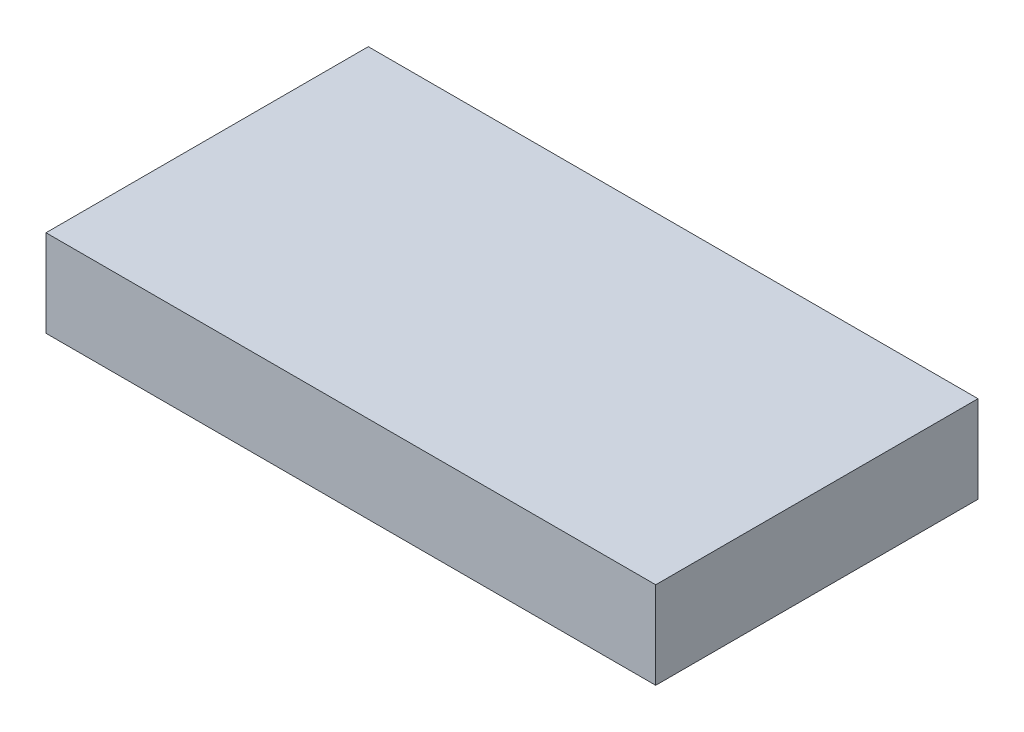
ISO-10303-21;
HEADER;
FILE_DESCRIPTION(('STEP AP214'),'2;1');
FILE_NAME('part.step','',(''),(''),'','','');
FILE_SCHEMA(('AUTOMOTIVE_DESIGN { 1 0 10303 214 1 1 1 1 }'));
ENDSEC;
DATA;
#1=APPLICATION_CONTEXT('core data for automotive mechanical design processes');
#2=APPLICATION_PROTOCOL_DEFINITION('international standard','automotive_design',2000,#1);
#3=PRODUCT_CONTEXT('',#1,'mechanical');
#4=PRODUCT('Part','Part','',(#3));
#5=PRODUCT_RELATED_PRODUCT_CATEGORY('part','',(#4));
#6=PRODUCT_DEFINITION_FORMATION('','',#4);
#7=PRODUCT_DEFINITION_CONTEXT('part definition',#1,'design');
#8=PRODUCT_DEFINITION('design','',#6,#7);
#9=PRODUCT_DEFINITION_SHAPE('','',#8);
#10=(LENGTH_UNIT() NAMED_UNIT(*) SI_UNIT(.MILLI.,.METRE.));
#11=(NAMED_UNIT(*) PLANE_ANGLE_UNIT() SI_UNIT($,.RADIAN.));
#12=(NAMED_UNIT(*) SI_UNIT($,.STERADIAN.) SOLID_ANGLE_UNIT());
#13=UNCERTAINTY_MEASURE_WITH_UNIT(LENGTH_MEASURE(1.E-05),#10,'distance_accuracy_value','');
#14=(GEOMETRIC_REPRESENTATION_CONTEXT(3) GLOBAL_UNCERTAINTY_ASSIGNED_CONTEXT((#13)) GLOBAL_UNIT_ASSIGNED_CONTEXT((#10,
#11,#12)) REPRESENTATION_CONTEXT('',''));
#15=CARTESIAN_POINT('',(0.,0.,0.));
#16=DIRECTION('',(0.,0.,1.));
#17=DIRECTION('',(1.,0.,0.));
#18=AXIS2_PLACEMENT_3D('',#15,#16,#17);
#19=CARTESIAN_POINT('',(0.,20.,0.));
#20=DIRECTION('',(1.,0.,0.));
#21=DIRECTION('',(0.,0.,-1.));
#22=AXIS2_PLACEMENT_3D('',#19,#20,#21);
#23=PLANE('',#22);
#24=DIRECTION('',(0.,0.,1.));
#25=VECTOR('',#24,1.);
#26=CARTESIAN_POINT('',(0.,0.,0.));
#27=LINE('',#26,#25);
#28=CARTESIAN_POINT('',(0.,0.,-74.));
#29=VERTEX_POINT('',#28);
#30=CARTESIAN_POINT('',(0.,0.,0.));
#31=VERTEX_POINT('',#30);
#32=EDGE_CURVE('E107',#29,#31,#27,.T.);
#33=ORIENTED_EDGE('',*,*,#32,.T.);
#34=DIRECTION('',(0.,-1.,0.));
#35=VECTOR('',#34,1.);
#36=CARTESIAN_POINT('',(0.,20.,0.));
#37=LINE('',#36,#35);
#38=CARTESIAN_POINT('',(0.,20.,0.));
#39=VERTEX_POINT('',#38);
#40=EDGE_CURVE('E11',#39,#31,#37,.T.);
#41=ORIENTED_EDGE('',*,*,#40,.F.);
#42=DIRECTION('',(0.,0.,1.));
#43=VECTOR('',#42,1.);
#44=CARTESIAN_POINT('',(0.,20.,0.));
#45=LINE('',#44,#43);
#46=CARTESIAN_POINT('',(0.,20.,-74.));
#47=VERTEX_POINT('',#46);
#48=EDGE_CURVE('E91',#47,#39,#45,.T.);
#49=ORIENTED_EDGE('',*,*,#48,.F.);
#50=DIRECTION('',(0.,-1.,0.));
#51=VECTOR('',#50,1.);
#52=CARTESIAN_POINT('',(0.,20.,-74.));
#53=LINE('',#52,#51);
#54=EDGE_CURVE('E103',#47,#29,#53,.T.);
#55=ORIENTED_EDGE('',*,*,#54,.T.);
#56=EDGE_LOOP('',(#33,#41,#49,#55));
#57=FACE_BOUND('',#56,.T.);
#58=ADVANCED_FACE('F39',(#57),#23,.F.);
#59=CARTESIAN_POINT('',(0.,20.,0.));
#60=DIRECTION('',(0.,0.,-1.));
#61=DIRECTION('',(-1.,0.,0.));
#62=AXIS2_PLACEMENT_3D('',#59,#60,#61);
#63=PLANE('',#62);
#64=DIRECTION('',(1.,0.,0.));
#65=VECTOR('',#64,1.);
#66=CARTESIAN_POINT('',(0.,0.,0.));
#67=LINE('',#66,#65);
#68=CARTESIAN_POINT('',(140.,0.,0.));
#69=VERTEX_POINT('',#68);
#70=EDGE_CURVE('E96',#31,#69,#67,.T.);
#71=ORIENTED_EDGE('',*,*,#70,.T.);
#72=DIRECTION('',(0.,-1.,0.));
#73=VECTOR('',#72,1.);
#74=CARTESIAN_POINT('',(140.,20.,0.));
#75=LINE('',#74,#73);
#76=CARTESIAN_POINT('',(140.,20.,0.));
#77=VERTEX_POINT('',#76);
#78=EDGE_CURVE('E48',#77,#69,#75,.T.);
#79=ORIENTED_EDGE('',*,*,#78,.F.);
#80=DIRECTION('',(1.,0.,0.));
#81=VECTOR('',#80,1.);
#82=CARTESIAN_POINT('',(0.,20.,0.));
#83=LINE('',#82,#81);
#84=EDGE_CURVE('E86',#39,#77,#83,.T.);
#85=ORIENTED_EDGE('',*,*,#84,.F.);
#86=ORIENTED_EDGE('',*,*,#40,.T.);
#87=EDGE_LOOP('',(#71,#79,#85,#86));
#88=FACE_BOUND('',#87,.T.);
#89=ADVANCED_FACE('F95',(#88),#63,.F.);
#90=CARTESIAN_POINT('',(140.,20.,0.));
#91=DIRECTION('',(-1.,0.,0.));
#92=DIRECTION('',(0.,0.,1.));
#93=AXIS2_PLACEMENT_3D('',#90,#91,#92);
#94=PLANE('',#93);
#95=DIRECTION('',(0.,0.,-1.));
#96=VECTOR('',#95,1.);
#97=CARTESIAN_POINT('',(140.,0.,0.));
#98=LINE('',#97,#96);
#99=CARTESIAN_POINT('',(140.,0.,-74.));
#100=VERTEX_POINT('',#99);
#101=EDGE_CURVE('E73',#69,#100,#98,.T.);
#102=ORIENTED_EDGE('',*,*,#101,.T.);
#103=DIRECTION('',(0.,-1.,0.));
#104=VECTOR('',#103,1.);
#105=CARTESIAN_POINT('',(140.,20.,-74.));
#106=LINE('',#105,#104);
#107=CARTESIAN_POINT('',(140.,20.,-74.));
#108=VERTEX_POINT('',#107);
#109=EDGE_CURVE('E98',#108,#100,#106,.T.);
#110=ORIENTED_EDGE('',*,*,#109,.F.);
#111=DIRECTION('',(0.,0.,-1.));
#112=VECTOR('',#111,1.);
#113=CARTESIAN_POINT('',(140.,20.,0.));
#114=LINE('',#113,#112);
#115=EDGE_CURVE('E89',#77,#108,#114,.T.);
#116=ORIENTED_EDGE('',*,*,#115,.F.);
#117=ORIENTED_EDGE('',*,*,#78,.T.);
#118=EDGE_LOOP('',(#102,#110,#116,#117));
#119=FACE_BOUND('',#118,.T.);
#120=ADVANCED_FACE('F99',(#119),#94,.F.);
#121=CARTESIAN_POINT('',(0.,20.,-74.));
#122=DIRECTION('',(0.,0.,1.));
#123=DIRECTION('',(1.,0.,0.));
#124=AXIS2_PLACEMENT_3D('',#121,#122,#123);
#125=PLANE('',#124);
#126=DIRECTION('',(-1.,0.,0.));
#127=VECTOR('',#126,1.);
#128=CARTESIAN_POINT('',(0.,0.,-74.));
#129=LINE('',#128,#127);
#130=EDGE_CURVE('E79',#100,#29,#129,.T.);
#131=ORIENTED_EDGE('',*,*,#130,.T.);
#132=ORIENTED_EDGE('',*,*,#54,.F.);
#133=DIRECTION('',(-1.,0.,0.));
#134=VECTOR('',#133,1.);
#135=CARTESIAN_POINT('',(0.,20.,-74.));
#136=LINE('',#135,#134);
#137=EDGE_CURVE('E56',#108,#47,#136,.T.);
#138=ORIENTED_EDGE('',*,*,#137,.F.);
#139=ORIENTED_EDGE('',*,*,#109,.T.);
#140=EDGE_LOOP('',(#131,#132,#138,#139));
#141=FACE_BOUND('',#140,.T.);
#142=ADVANCED_FACE('F120',(#141),#125,.F.);
#143=CARTESIAN_POINT('',(0.,20.,0.));
#144=DIRECTION('',(0.,-1.,0.));
#145=DIRECTION('',(0.,0.,-1.));
#146=AXIS2_PLACEMENT_3D('',#143,#144,#145);
#147=PLANE('',#146);
#148=ORIENTED_EDGE('',*,*,#48,.T.);
#149=ORIENTED_EDGE('',*,*,#84,.T.);
#150=ORIENTED_EDGE('',*,*,#115,.T.);
#151=ORIENTED_EDGE('',*,*,#137,.T.);
#152=EDGE_LOOP('',(#148,#149,#150,#151));
#153=FACE_BOUND('',#152,.T.);
#154=ADVANCED_FACE('F87',(#153),#147,.F.);
#155=CARTESIAN_POINT('',(0.,0.,0.));
#156=DIRECTION('',(0.,-1.,0.));
#157=DIRECTION('',(0.,0.,-1.));
#158=AXIS2_PLACEMENT_3D('',#155,#156,#157);
#159=PLANE('',#158);
#160=ORIENTED_EDGE('',*,*,#32,.F.);
#161=ORIENTED_EDGE('',*,*,#130,.F.);
#162=ORIENTED_EDGE('',*,*,#101,.F.);
#163=ORIENTED_EDGE('',*,*,#70,.F.);
#164=EDGE_LOOP('',(#160,#161,#162,#163));
#165=FACE_BOUND('',#164,.T.);
#166=ADVANCED_FACE('F123',(#165),#159,.T.);
#167=CLOSED_SHELL('',(#58,#89,#120,#142,#154,#166));
#168=MANIFOLD_SOLID_BREP('B2',#167);
#169=ADVANCED_BREP_SHAPE_REPRESENTATION('',(#18,#168),#14);
#170=SHAPE_DEFINITION_REPRESENTATION(#9,#169);
ENDSEC;
END-ISO-10303-21;
